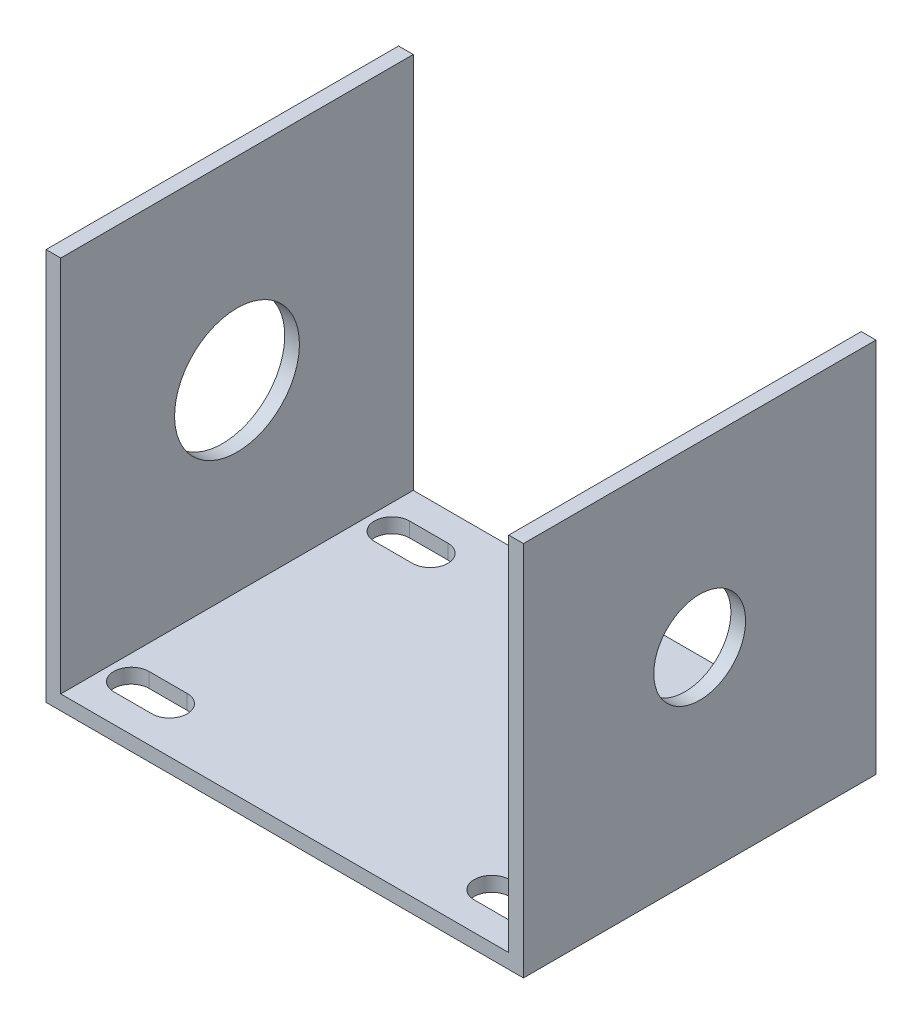
ISO-10303-21;
HEADER;
FILE_DESCRIPTION(('STEP AP214'),'2;1');
FILE_NAME('part.step','',(''),(''),'','','');
FILE_SCHEMA(('AUTOMOTIVE_DESIGN { 1 0 10303 214 1 1 1 1 }'));
ENDSEC;
DATA;
#1=APPLICATION_CONTEXT('core data for automotive mechanical design processes');
#2=APPLICATION_PROTOCOL_DEFINITION('international standard','automotive_design',2000,#1);
#3=PRODUCT_CONTEXT('',#1,'mechanical');
#4=PRODUCT('Part','Part','',(#3));
#5=PRODUCT_RELATED_PRODUCT_CATEGORY('part','',(#4));
#6=PRODUCT_DEFINITION_FORMATION('','',#4);
#7=PRODUCT_DEFINITION_CONTEXT('part definition',#1,'design');
#8=PRODUCT_DEFINITION('design','',#6,#7);
#9=PRODUCT_DEFINITION_SHAPE('','',#8);
#10=(LENGTH_UNIT() NAMED_UNIT(*) SI_UNIT(.MILLI.,.METRE.));
#11=(NAMED_UNIT(*) PLANE_ANGLE_UNIT() SI_UNIT($,.RADIAN.));
#12=(NAMED_UNIT(*) SI_UNIT($,.STERADIAN.) SOLID_ANGLE_UNIT());
#13=UNCERTAINTY_MEASURE_WITH_UNIT(LENGTH_MEASURE(1.E-05),#10,'distance_accuracy_value','');
#14=(GEOMETRIC_REPRESENTATION_CONTEXT(3) GLOBAL_UNCERTAINTY_ASSIGNED_CONTEXT((#13)) GLOBAL_UNIT_ASSIGNED_CONTEXT((#10,
#11,#12)) REPRESENTATION_CONTEXT('',''));
#15=CARTESIAN_POINT('',(0.,0.,0.));
#16=DIRECTION('',(0.,0.,1.));
#17=DIRECTION('',(1.,0.,0.));
#18=AXIS2_PLACEMENT_3D('',#15,#16,#17);
#19=CARTESIAN_POINT('',(0.,-0.5,12.));
#20=DIRECTION('',(0.,-1.,0.));
#21=DIRECTION('',(1.,0.,0.));
#22=AXIS2_PLACEMENT_3D('',#19,#20,#21);
#23=PLANE('',#22);
#24=CARTESIAN_POINT('',(10.97,-0.499999999999999,-8.87));
#25=DIRECTION('',(0.,-1.,0.));
#26=DIRECTION('',(1.,0.,0.));
#27=AXIS2_PLACEMENT_3D('',#24,#25,#26);
#28=CIRCLE('',#27,1.2);
#29=CARTESIAN_POINT('',(10.97,-0.499999999999999,-7.67000000000001));
#30=VERTEX_POINT('',#29);
#31=CARTESIAN_POINT('',(10.97,-0.499999999999999,-10.07));
#32=VERTEX_POINT('',#31);
#33=EDGE_CURVE('E114',#30,#32,#28,.T.);
#34=ORIENTED_EDGE('',*,*,#33,.F.);
#35=DIRECTION('',(-1.,0.,0.));
#36=VECTOR('',#35,1.);
#37=CARTESIAN_POINT('',(0.,-0.5,-7.67000000000002));
#38=LINE('',#37,#36);
#39=CARTESIAN_POINT('',(13.57,-0.499999999999998,-7.67));
#40=VERTEX_POINT('',#39);
#41=EDGE_CURVE('E323',#40,#30,#38,.T.);
#42=ORIENTED_EDGE('',*,*,#41,.F.);
#43=CARTESIAN_POINT('',(13.57,-0.499999999999998,-8.87));
#44=DIRECTION('',(0.,-1.,0.));
#45=DIRECTION('',(1.,0.,0.));
#46=AXIS2_PLACEMENT_3D('',#43,#44,#45);
#47=CIRCLE('',#46,1.2);
#48=CARTESIAN_POINT('',(13.57,-0.499999999999998,-10.07));
#49=VERTEX_POINT('',#48);
#50=EDGE_CURVE('E335',#49,#40,#47,.T.);
#51=ORIENTED_EDGE('',*,*,#50,.F.);
#52=DIRECTION('',(-1.,0.,0.));
#53=VECTOR('',#52,1.);
#54=CARTESIAN_POINT('',(0.,-0.5,-10.07));
#55=LINE('',#54,#53);
#56=EDGE_CURVE('E339',#49,#32,#55,.T.);
#57=ORIENTED_EDGE('',*,*,#56,.T.);
#58=EDGE_LOOP('',(#34,#42,#51,#57));
#59=FACE_BOUND('',#58,.T.);
#60=DIRECTION('',(1.,0.,0.));
#61=VECTOR('',#60,1.);
#62=CARTESIAN_POINT('',(0.,-0.5,-10.07));
#63=LINE('',#62,#61);
#64=CARTESIAN_POINT('',(-13.57,-0.500000000000002,-10.07));
#65=VERTEX_POINT('',#64);
#66=CARTESIAN_POINT('',(-10.97,-0.5,-10.07));
#67=VERTEX_POINT('',#66);
#68=EDGE_CURVE('E280',#65,#67,#63,.T.);
#69=ORIENTED_EDGE('',*,*,#68,.F.);
#70=CARTESIAN_POINT('',(-13.57,-0.500000000000002,-8.87));
#71=DIRECTION('',(0.,-1.,0.));
#72=DIRECTION('',(1.,0.,0.));
#73=AXIS2_PLACEMENT_3D('',#70,#71,#72);
#74=CIRCLE('',#73,1.2);
#75=CARTESIAN_POINT('',(-13.57,-0.500000000000002,-7.67));
#76=VERTEX_POINT('',#75);
#77=EDGE_CURVE('E263',#65,#76,#74,.F.);
#78=ORIENTED_EDGE('',*,*,#77,.T.);
#79=DIRECTION('',(1.,0.,0.));
#80=VECTOR('',#79,1.);
#81=CARTESIAN_POINT('',(0.,-0.5,-7.67000000000002));
#82=LINE('',#81,#80);
#83=CARTESIAN_POINT('',(-10.97,-0.500000000000001,-7.67000000000001));
#84=VERTEX_POINT('',#83);
#85=EDGE_CURVE('E274',#76,#84,#82,.T.);
#86=ORIENTED_EDGE('',*,*,#85,.T.);
#87=CARTESIAN_POINT('',(-10.97,-0.500000000000001,-8.87));
#88=DIRECTION('',(0.,1.,0.));
#89=DIRECTION('',(-1.,0.,0.));
#90=AXIS2_PLACEMENT_3D('',#87,#88,#89);
#91=CIRCLE('',#90,1.2);
#92=EDGE_CURVE('E285',#84,#67,#91,.T.);
#93=ORIENTED_EDGE('',*,*,#92,.T.);
#94=EDGE_LOOP('',(#69,#78,#86,#93));
#95=FACE_BOUND('',#94,.T.);
#96=DIRECTION('',(-1.,0.,0.));
#97=VECTOR('',#96,1.);
#98=CARTESIAN_POINT('',(0.,-0.5,10.07));
#99=LINE('',#98,#97);
#100=CARTESIAN_POINT('',(13.57,-0.499999999999998,10.07));
#101=VERTEX_POINT('',#100);
#102=CARTESIAN_POINT('',(10.97,-0.5,10.07));
#103=VERTEX_POINT('',#102);
#104=EDGE_CURVE('E356',#101,#103,#99,.T.);
#105=ORIENTED_EDGE('',*,*,#104,.F.);
#106=CARTESIAN_POINT('',(13.57,-0.499999999999998,8.87));
#107=DIRECTION('',(0.,-1.,0.));
#108=DIRECTION('',(1.,0.,0.));
#109=AXIS2_PLACEMENT_3D('',#106,#107,#108);
#110=CIRCLE('',#109,1.2);
#111=CARTESIAN_POINT('',(13.57,-0.499999999999998,7.67));
#112=VERTEX_POINT('',#111);
#113=EDGE_CURVE('E352',#101,#112,#110,.F.);
#114=ORIENTED_EDGE('',*,*,#113,.T.);
#115=DIRECTION('',(-1.,0.,0.));
#116=VECTOR('',#115,1.);
#117=CARTESIAN_POINT('',(0.,-0.5,7.67000000000002));
#118=LINE('',#117,#116);
#119=CARTESIAN_POINT('',(10.97,-0.499999999999999,7.67000000000001));
#120=VERTEX_POINT('',#119);
#121=EDGE_CURVE('E348',#112,#120,#118,.T.);
#122=ORIENTED_EDGE('',*,*,#121,.T.);
#123=CARTESIAN_POINT('',(10.97,-0.499999999999999,8.87));
#124=DIRECTION('',(0.,-1.,0.));
#125=DIRECTION('',(1.,0.,0.));
#126=AXIS2_PLACEMENT_3D('',#123,#124,#125);
#127=CIRCLE('',#126,1.2);
#128=EDGE_CURVE('E319',#120,#103,#127,.F.);
#129=ORIENTED_EDGE('',*,*,#128,.T.);
#130=EDGE_LOOP('',(#105,#114,#122,#129));
#131=FACE_BOUND('',#130,.T.);
#132=DIRECTION('',(-1.,0.,0.));
#133=VECTOR('',#132,1.);
#134=CARTESIAN_POINT('',(0.,-0.5,-12.));
#135=LINE('',#134,#133);
#136=CARTESIAN_POINT('',(16.25,-0.499999999999998,-12.));
#137=VERTEX_POINT('',#136);
#138=CARTESIAN_POINT('',(-16.25,-0.500000000000002,-12.));
#139=VERTEX_POINT('',#138);
#140=EDGE_CURVE('E419',#137,#139,#135,.T.);
#141=ORIENTED_EDGE('',*,*,#140,.F.);
#142=DIRECTION('',(0.,0.,-1.));
#143=VECTOR('',#142,1.);
#144=CARTESIAN_POINT('',(16.25,-0.499999999999998,12.));
#145=LINE('',#144,#143);
#146=CARTESIAN_POINT('',(16.25,-0.499999999999998,12.));
#147=VERTEX_POINT('',#146);
#148=EDGE_CURVE('E463',#147,#137,#145,.T.);
#149=ORIENTED_EDGE('',*,*,#148,.F.);
#150=DIRECTION('',(-1.,0.,0.));
#151=VECTOR('',#150,1.);
#152=CARTESIAN_POINT('',(0.,-0.5,12.));
#153=LINE('',#152,#151);
#154=CARTESIAN_POINT('',(-16.25,-0.500000000000002,12.));
#155=VERTEX_POINT('',#154);
#156=EDGE_CURVE('E390',#147,#155,#153,.T.);
#157=ORIENTED_EDGE('',*,*,#156,.T.);
#158=DIRECTION('',(0.,0.,-1.));
#159=VECTOR('',#158,1.);
#160=CARTESIAN_POINT('',(-16.25,-0.500000000000002,12.));
#161=LINE('',#160,#159);
#162=EDGE_CURVE('E466',#155,#139,#161,.T.);
#163=ORIENTED_EDGE('',*,*,#162,.T.);
#164=EDGE_LOOP('',(#141,#149,#157,#163));
#165=FACE_BOUND('',#164,.T.);
#166=CARTESIAN_POINT('',(-13.57,-0.500000000000002,8.87));
#167=DIRECTION('',(0.,-1.,0.));
#168=DIRECTION('',(1.,0.,0.));
#169=AXIS2_PLACEMENT_3D('',#166,#167,#168);
#170=CIRCLE('',#169,1.2);
#171=CARTESIAN_POINT('',(-13.57,-0.500000000000002,10.07));
#172=VERTEX_POINT('',#171);
#173=CARTESIAN_POINT('',(-13.57,-0.500000000000002,7.67));
#174=VERTEX_POINT('',#173);
#175=EDGE_CURVE('E106',#172,#174,#170,.T.);
#176=ORIENTED_EDGE('',*,*,#175,.F.);
#177=DIRECTION('',(1.,0.,0.));
#178=VECTOR('',#177,1.);
#179=CARTESIAN_POINT('',(0.,-0.5,10.07));
#180=LINE('',#179,#178);
#181=CARTESIAN_POINT('',(-10.97,-0.500000000000001,10.07));
#182=VERTEX_POINT('',#181);
#183=EDGE_CURVE('E296',#172,#182,#180,.T.);
#184=ORIENTED_EDGE('',*,*,#183,.T.);
#185=CARTESIAN_POINT('',(-10.97,-0.500000000000001,8.87));
#186=DIRECTION('',(0.,-1.,0.));
#187=DIRECTION('',(1.,0.,0.));
#188=AXIS2_PLACEMENT_3D('',#185,#186,#187);
#189=CIRCLE('',#188,1.2);
#190=CARTESIAN_POINT('',(-10.97,-0.500000000000001,7.67000000000001));
#191=VERTEX_POINT('',#190);
#192=EDGE_CURVE('E309',#191,#182,#189,.T.);
#193=ORIENTED_EDGE('',*,*,#192,.F.);
#194=DIRECTION('',(1.,0.,0.));
#195=VECTOR('',#194,1.);
#196=CARTESIAN_POINT('',(0.,-0.5,7.67000000000002));
#197=LINE('',#196,#195);
#198=EDGE_CURVE('E313',#174,#191,#197,.T.);
#199=ORIENTED_EDGE('',*,*,#198,.F.);
#200=EDGE_LOOP('',(#176,#184,#193,#199));
#201=FACE_BOUND('',#200,.T.);
#202=ADVANCED_FACE('F90',(#59,#95,#131,#165,#201),#23,.T.);
#203=CARTESIAN_POINT('',(0.,0.5,12.));
#204=DIRECTION('',(0.,-1.,0.));
#205=DIRECTION('',(1.,0.,0.));
#206=AXIS2_PLACEMENT_3D('',#203,#204,#205);
#207=PLANE('',#206);
#208=CARTESIAN_POINT('',(-13.57,0.5,-8.87));
#209=DIRECTION('',(0.,-1.,0.));
#210=DIRECTION('',(1.,0.,0.));
#211=AXIS2_PLACEMENT_3D('',#208,#209,#210);
#212=CIRCLE('',#211,1.2);
#213=CARTESIAN_POINT('',(-13.57,0.499999999999997,-10.07));
#214=VERTEX_POINT('',#213);
#215=CARTESIAN_POINT('',(-13.57,0.499999999999997,-7.67));
#216=VERTEX_POINT('',#215);
#217=EDGE_CURVE('E266',#214,#216,#212,.F.);
#218=ORIENTED_EDGE('',*,*,#217,.F.);
#219=DIRECTION('',(1.,0.,0.));
#220=VECTOR('',#219,1.);
#221=CARTESIAN_POINT('',(0.,0.5,-10.07));
#222=LINE('',#221,#220);
#223=CARTESIAN_POINT('',(-10.97,0.5,-10.07));
#224=VERTEX_POINT('',#223);
#225=EDGE_CURVE('E489',#214,#224,#222,.T.);
#226=ORIENTED_EDGE('',*,*,#225,.T.);
#227=CARTESIAN_POINT('',(-10.97,0.5,-8.87));
#228=DIRECTION('',(0.,-1.,0.));
#229=DIRECTION('',(1.,0.,0.));
#230=AXIS2_PLACEMENT_3D('',#227,#228,#229);
#231=CIRCLE('',#230,1.2);
#232=CARTESIAN_POINT('',(-10.97,0.5,-7.67));
#233=VERTEX_POINT('',#232);
#234=EDGE_CURVE('E486',#233,#224,#231,.F.);
#235=ORIENTED_EDGE('',*,*,#234,.F.);
#236=DIRECTION('',(1.,0.,0.));
#237=VECTOR('',#236,1.);
#238=CARTESIAN_POINT('',(0.,0.5,-7.67000000000002));
#239=LINE('',#238,#237);
#240=EDGE_CURVE('E493',#216,#233,#239,.T.);
#241=ORIENTED_EDGE('',*,*,#240,.F.);
#242=EDGE_LOOP('',(#218,#226,#235,#241));
#243=FACE_BOUND('',#242,.T.);
#244=CARTESIAN_POINT('',(13.57,0.5,8.87));
#245=DIRECTION('',(0.,-1.,0.));
#246=DIRECTION('',(1.,0.,0.));
#247=AXIS2_PLACEMENT_3D('',#244,#245,#246);
#248=CIRCLE('',#247,1.2);
#249=CARTESIAN_POINT('',(13.57,0.5,10.07));
#250=VERTEX_POINT('',#249);
#251=CARTESIAN_POINT('',(13.57,0.5,7.67));
#252=VERTEX_POINT('',#251);
#253=EDGE_CURVE('E483',#250,#252,#248,.F.);
#254=ORIENTED_EDGE('',*,*,#253,.F.);
#255=DIRECTION('',(-1.,0.,0.));
#256=VECTOR('',#255,1.);
#257=CARTESIAN_POINT('',(0.,0.5,10.07));
#258=LINE('',#257,#256);
#259=CARTESIAN_POINT('',(10.97,0.5,10.07));
#260=VERTEX_POINT('',#259);
#261=EDGE_CURVE('E479',#250,#260,#258,.T.);
#262=ORIENTED_EDGE('',*,*,#261,.T.);
#263=CARTESIAN_POINT('',(10.97,0.5,8.87));
#264=DIRECTION('',(0.,-1.,0.));
#265=DIRECTION('',(1.,0.,0.));
#266=AXIS2_PLACEMENT_3D('',#263,#264,#265);
#267=CIRCLE('',#266,1.2);
#268=CARTESIAN_POINT('',(10.97,0.5,7.67));
#269=VERTEX_POINT('',#268);
#270=EDGE_CURVE('E469',#269,#260,#267,.F.);
#271=ORIENTED_EDGE('',*,*,#270,.F.);
#272=DIRECTION('',(-1.,0.,0.));
#273=VECTOR('',#272,1.);
#274=CARTESIAN_POINT('',(0.,0.5,7.67000000000002));
#275=LINE('',#274,#273);
#276=EDGE_CURVE('E475',#252,#269,#275,.T.);
#277=ORIENTED_EDGE('',*,*,#276,.F.);
#278=EDGE_LOOP('',(#254,#262,#271,#277));
#279=FACE_BOUND('',#278,.T.);
#280=DIRECTION('',(-1.,0.,0.));
#281=VECTOR('',#280,1.);
#282=CARTESIAN_POINT('',(0.,0.5,-12.));
#283=LINE('',#282,#281);
#284=CARTESIAN_POINT('',(15.25,0.500000000000002,-12.));
#285=VERTEX_POINT('',#284);
#286=CARTESIAN_POINT('',(-15.25,0.499999999999998,-12.));
#287=VERTEX_POINT('',#286);
#288=EDGE_CURVE('E434',#285,#287,#283,.T.);
#289=ORIENTED_EDGE('',*,*,#288,.T.);
#290=DIRECTION('',(0.,0.,-1.));
#291=VECTOR('',#290,1.);
#292=CARTESIAN_POINT('',(-15.25,0.499999999999998,12.));
#293=LINE('',#292,#291);
#294=CARTESIAN_POINT('',(-15.25,0.499999999999998,12.));
#295=VERTEX_POINT('',#294);
#296=EDGE_CURVE('E449',#295,#287,#293,.T.);
#297=ORIENTED_EDGE('',*,*,#296,.F.);
#298=DIRECTION('',(-1.,0.,0.));
#299=VECTOR('',#298,1.);
#300=CARTESIAN_POINT('',(0.,0.5,12.));
#301=LINE('',#300,#299);
#302=CARTESIAN_POINT('',(15.25,0.500000000000002,12.));
#303=VERTEX_POINT('',#302);
#304=EDGE_CURVE('E405',#303,#295,#301,.T.);
#305=ORIENTED_EDGE('',*,*,#304,.F.);
#306=DIRECTION('',(0.,0.,-1.));
#307=VECTOR('',#306,1.);
#308=CARTESIAN_POINT('',(15.25,0.500000000000002,12.));
#309=LINE('',#308,#307);
#310=EDGE_CURVE('E453',#303,#285,#309,.T.);
#311=ORIENTED_EDGE('',*,*,#310,.T.);
#312=EDGE_LOOP('',(#289,#297,#305,#311));
#313=FACE_BOUND('',#312,.T.);
#314=DIRECTION('',(-1.,0.,0.));
#315=VECTOR('',#314,1.);
#316=CARTESIAN_POINT('',(0.,0.5,-7.67000000000002));
#317=LINE('',#316,#315);
#318=CARTESIAN_POINT('',(13.57,0.5,-7.67));
#319=VERTEX_POINT('',#318);
#320=CARTESIAN_POINT('',(10.97,0.5,-7.67000000000001));
#321=VERTEX_POINT('',#320);
#322=EDGE_CURVE('E505',#319,#321,#317,.T.);
#323=ORIENTED_EDGE('',*,*,#322,.T.);
#324=CARTESIAN_POINT('',(10.97,0.5,-8.87));
#325=DIRECTION('',(0.,-1.,0.));
#326=DIRECTION('',(1.,0.,0.));
#327=AXIS2_PLACEMENT_3D('',#324,#325,#326);
#328=CIRCLE('',#327,1.2);
#329=CARTESIAN_POINT('',(10.97,0.5,-10.07));
#330=VERTEX_POINT('',#329);
#331=EDGE_CURVE('E509',#321,#330,#328,.T.);
#332=ORIENTED_EDGE('',*,*,#331,.T.);
#333=DIRECTION('',(-1.,0.,0.));
#334=VECTOR('',#333,1.);
#335=CARTESIAN_POINT('',(0.,0.5,-10.07));
#336=LINE('',#335,#334);
#337=CARTESIAN_POINT('',(13.57,0.500000000000002,-10.07));
#338=VERTEX_POINT('',#337);
#339=EDGE_CURVE('E498',#338,#330,#336,.T.);
#340=ORIENTED_EDGE('',*,*,#339,.F.);
#341=CARTESIAN_POINT('',(13.57,0.5,-8.87));
#342=DIRECTION('',(0.,-1.,0.));
#343=DIRECTION('',(1.,0.,0.));
#344=AXIS2_PLACEMENT_3D('',#341,#342,#343);
#345=CIRCLE('',#344,1.2);
#346=EDGE_CURVE('E501',#338,#319,#345,.T.);
#347=ORIENTED_EDGE('',*,*,#346,.T.);
#348=EDGE_LOOP('',(#323,#332,#340,#347));
#349=FACE_BOUND('',#348,.T.);
#350=DIRECTION('',(1.,0.,0.));
#351=VECTOR('',#350,1.);
#352=CARTESIAN_POINT('',(0.,0.5,10.07));
#353=LINE('',#352,#351);
#354=CARTESIAN_POINT('',(-13.57,0.499999999999997,10.07));
#355=VERTEX_POINT('',#354);
#356=CARTESIAN_POINT('',(-10.97,0.5,10.07));
#357=VERTEX_POINT('',#356);
#358=EDGE_CURVE('E99',#355,#357,#353,.T.);
#359=ORIENTED_EDGE('',*,*,#358,.F.);
#360=CARTESIAN_POINT('',(-13.57,0.5,8.87));
#361=DIRECTION('',(0.,-1.,0.));
#362=DIRECTION('',(1.,0.,0.));
#363=AXIS2_PLACEMENT_3D('',#360,#361,#362);
#364=CIRCLE('',#363,1.2);
#365=CARTESIAN_POINT('',(-13.57,0.499999999999997,7.67));
#366=VERTEX_POINT('',#365);
#367=EDGE_CURVE('E12',#355,#366,#364,.T.);
#368=ORIENTED_EDGE('',*,*,#367,.T.);
#369=DIRECTION('',(1.,0.,0.));
#370=VECTOR('',#369,1.);
#371=CARTESIAN_POINT('',(0.,0.5,7.67000000000002));
#372=LINE('',#371,#370);
#373=CARTESIAN_POINT('',(-10.97,0.499999999999999,7.67000000000001));
#374=VERTEX_POINT('',#373);
#375=EDGE_CURVE('E513',#366,#374,#372,.T.);
#376=ORIENTED_EDGE('',*,*,#375,.T.);
#377=CARTESIAN_POINT('',(-10.97,0.5,8.87));
#378=DIRECTION('',(0.,-1.,0.));
#379=DIRECTION('',(1.,0.,0.));
#380=AXIS2_PLACEMENT_3D('',#377,#378,#379);
#381=CIRCLE('',#380,1.2);
#382=EDGE_CURVE('E517',#374,#357,#381,.T.);
#383=ORIENTED_EDGE('',*,*,#382,.T.);
#384=EDGE_LOOP('',(#359,#368,#376,#383));
#385=FACE_BOUND('',#384,.T.);
#386=ADVANCED_FACE('F532',(#243,#279,#313,#349,#385),#207,.F.);
#387=CARTESIAN_POINT('',(-16.25,0.,12.));
#388=DIRECTION('',(-1.,0.,0.));
#389=DIRECTION('',(0.,-1.,0.));
#390=AXIS2_PLACEMENT_3D('',#387,#388,#389);
#391=PLANE('',#390);
#392=CARTESIAN_POINT('',(-16.25,13.,0.));
#393=DIRECTION('',(-1.,0.,0.));
#394=DIRECTION('',(0.,-1.,0.));
#395=AXIS2_PLACEMENT_3D('',#392,#393,#394);
#396=CIRCLE('',#395,4.25);
#397=CARTESIAN_POINT('',(-16.25,17.25,0.));
#398=VERTEX_POINT('',#397);
#399=EDGE_CURVE('E373',#398,#398,#396,.F.);
#400=ORIENTED_EDGE('',*,*,#399,.T.);
#401=EDGE_LOOP('',(#400));
#402=FACE_BOUND('',#401,.T.);
#403=DIRECTION('',(0.,1.,0.));
#404=VECTOR('',#403,1.);
#405=CARTESIAN_POINT('',(-16.25,0.,-12.));
#406=LINE('',#405,#404);
#407=CARTESIAN_POINT('',(-16.25,26.2,-12.));
#408=VERTEX_POINT('',#407);
#409=EDGE_CURVE('E385',#139,#408,#406,.T.);
#410=ORIENTED_EDGE('',*,*,#409,.F.);
#411=ORIENTED_EDGE('',*,*,#162,.F.);
#412=DIRECTION('',(0.,1.,0.));
#413=VECTOR('',#412,1.);
#414=CARTESIAN_POINT('',(-16.25,0.,12.));
#415=LINE('',#414,#413);
#416=CARTESIAN_POINT('',(-16.25,26.2,12.));
#417=VERTEX_POINT('',#416);
#418=EDGE_CURVE('E386',#155,#417,#415,.T.);
#419=ORIENTED_EDGE('',*,*,#418,.T.);
#420=DIRECTION('',(0.,0.,-1.));
#421=VECTOR('',#420,1.);
#422=CARTESIAN_POINT('',(-16.25,26.2,12.));
#423=LINE('',#422,#421);
#424=EDGE_CURVE('E415',#417,#408,#423,.T.);
#425=ORIENTED_EDGE('',*,*,#424,.T.);
#426=EDGE_LOOP('',(#410,#411,#419,#425));
#427=FACE_BOUND('',#426,.T.);
#428=ADVANCED_FACE('F92',(#402,#427),#391,.T.);
#429=CARTESIAN_POINT('',(16.25,0.,12.));
#430=DIRECTION('',(-1.,0.,0.));
#431=DIRECTION('',(0.,0.,1.));
#432=AXIS2_PLACEMENT_3D('',#429,#430,#431);
#433=PLANE('',#432);
#434=CARTESIAN_POINT('',(16.25,13.,0.));
#435=DIRECTION('',(-1.,0.,0.));
#436=DIRECTION('',(0.,0.,1.));
#437=AXIS2_PLACEMENT_3D('',#434,#435,#436);
#438=CIRCLE('',#437,3.125);
#439=CARTESIAN_POINT('',(16.25,13.,3.125));
#440=VERTEX_POINT('',#439);
#441=EDGE_CURVE('E381',#440,#440,#438,.T.);
#442=ORIENTED_EDGE('',*,*,#441,.T.);
#443=EDGE_LOOP('',(#442));
#444=FACE_BOUND('',#443,.T.);
#445=DIRECTION('',(0.,1.,0.));
#446=VECTOR('',#445,1.);
#447=CARTESIAN_POINT('',(16.25,0.,-12.));
#448=LINE('',#447,#446);
#449=CARTESIAN_POINT('',(16.25,25.1137931034483,-12.));
#450=VERTEX_POINT('',#449);
#451=EDGE_CURVE('E423',#137,#450,#448,.T.);
#452=ORIENTED_EDGE('',*,*,#451,.T.);
#453=DIRECTION('',(0.,0.,-1.));
#454=VECTOR('',#453,1.);
#455=CARTESIAN_POINT('',(16.25,25.1137931034483,12.));
#456=LINE('',#455,#454);
#457=CARTESIAN_POINT('',(16.25,25.1137931034483,12.));
#458=VERTEX_POINT('',#457);
#459=EDGE_CURVE('E459',#458,#450,#456,.T.);
#460=ORIENTED_EDGE('',*,*,#459,.F.);
#461=DIRECTION('',(0.,1.,0.));
#462=VECTOR('',#461,1.);
#463=CARTESIAN_POINT('',(16.25,0.,12.));
#464=LINE('',#463,#462);
#465=EDGE_CURVE('E395',#147,#458,#464,.T.);
#466=ORIENTED_EDGE('',*,*,#465,.F.);
#467=ORIENTED_EDGE('',*,*,#148,.T.);
#468=EDGE_LOOP('',(#452,#460,#466,#467));
#469=FACE_BOUND('',#468,.T.);
#470=ADVANCED_FACE('F546',(#444,#469),#433,.F.);
#471=CARTESIAN_POINT('',(0.,25.1137931034482,12.));
#472=DIRECTION('',(0.,-1.,0.));
#473=DIRECTION('',(1.,0.,0.));
#474=AXIS2_PLACEMENT_3D('',#471,#472,#473);
#475=PLANE('',#474);
#476=DIRECTION('',(-1.,0.,0.));
#477=VECTOR('',#476,1.);
#478=CARTESIAN_POINT('',(0.,25.1137931034482,-12.));
#479=LINE('',#478,#477);
#480=CARTESIAN_POINT('',(15.25,25.1137931034483,-12.));
#481=VERTEX_POINT('',#480);
#482=EDGE_CURVE('E426',#450,#481,#479,.T.);
#483=ORIENTED_EDGE('',*,*,#482,.T.);
#484=DIRECTION('',(0.,0.,-1.));
#485=VECTOR('',#484,1.);
#486=CARTESIAN_POINT('',(15.25,25.1137931034483,12.));
#487=LINE('',#486,#485);
#488=CARTESIAN_POINT('',(15.25,25.1137931034483,12.));
#489=VERTEX_POINT('',#488);
#490=EDGE_CURVE('E456',#489,#481,#487,.T.);
#491=ORIENTED_EDGE('',*,*,#490,.F.);
#492=DIRECTION('',(-1.,0.,0.));
#493=VECTOR('',#492,1.);
#494=CARTESIAN_POINT('',(0.,25.1137931034482,12.));
#495=LINE('',#494,#493);
#496=EDGE_CURVE('E398',#458,#489,#495,.T.);
#497=ORIENTED_EDGE('',*,*,#496,.F.);
#498=ORIENTED_EDGE('',*,*,#459,.T.);
#499=EDGE_LOOP('',(#483,#491,#497,#498));
#500=FACE_BOUND('',#499,.T.);
#501=ADVANCED_FACE('F549',(#500),#475,.F.);
#502=CARTESIAN_POINT('',(15.25,0.,12.));
#503=DIRECTION('',(-1.,0.,0.));
#504=DIRECTION('',(0.,-1.,0.));
#505=AXIS2_PLACEMENT_3D('',#502,#503,#504);
#506=PLANE('',#505);
#507=CARTESIAN_POINT('',(15.25,13.,0.));
#508=DIRECTION('',(-1.,0.,0.));
#509=DIRECTION('',(0.,-1.,0.));
#510=AXIS2_PLACEMENT_3D('',#507,#508,#509);
#511=CIRCLE('',#510,3.125);
#512=CARTESIAN_POINT('',(15.25,9.875,0.));
#513=VERTEX_POINT('',#512);
#514=EDGE_CURVE('E377',#513,#513,#511,.T.);
#515=ORIENTED_EDGE('',*,*,#514,.F.);
#516=EDGE_LOOP('',(#515));
#517=FACE_BOUND('',#516,.T.);
#518=DIRECTION('',(0.,1.,0.));
#519=VECTOR('',#518,1.);
#520=CARTESIAN_POINT('',(15.25,0.,-12.));
#521=LINE('',#520,#519);
#522=EDGE_CURVE('E430',#285,#481,#521,.T.);
#523=ORIENTED_EDGE('',*,*,#522,.F.);
#524=ORIENTED_EDGE('',*,*,#310,.F.);
#525=DIRECTION('',(0.,1.,0.));
#526=VECTOR('',#525,1.);
#527=CARTESIAN_POINT('',(15.25,0.,12.));
#528=LINE('',#527,#526);
#529=EDGE_CURVE('E401',#303,#489,#528,.T.);
#530=ORIENTED_EDGE('',*,*,#529,.T.);
#531=ORIENTED_EDGE('',*,*,#490,.T.);
#532=EDGE_LOOP('',(#523,#524,#530,#531));
#533=FACE_BOUND('',#532,.T.);
#534=ADVANCED_FACE('F553',(#517,#533),#506,.T.);
#535=CARTESIAN_POINT('',(-15.25,0.,12.));
#536=DIRECTION('',(-1.,0.,0.));
#537=DIRECTION('',(0.,-1.,0.));
#538=AXIS2_PLACEMENT_3D('',#535,#536,#537);
#539=PLANE('',#538);
#540=CARTESIAN_POINT('',(-15.25,13.,0.));
#541=DIRECTION('',(-1.,0.,0.));
#542=DIRECTION('',(0.,-1.,0.));
#543=AXIS2_PLACEMENT_3D('',#540,#541,#542);
#544=CIRCLE('',#543,4.25);
#545=CARTESIAN_POINT('',(-15.25,17.25,0.));
#546=VERTEX_POINT('',#545);
#547=EDGE_CURVE('E364',#546,#546,#544,.F.);
#548=ORIENTED_EDGE('',*,*,#547,.F.);
#549=EDGE_LOOP('',(#548));
#550=FACE_BOUND('',#549,.T.);
#551=DIRECTION('',(0.,1.,0.));
#552=VECTOR('',#551,1.);
#553=CARTESIAN_POINT('',(-15.25,0.,-12.));
#554=LINE('',#553,#552);
#555=CARTESIAN_POINT('',(-15.25,26.2,-12.));
#556=VERTEX_POINT('',#555);
#557=EDGE_CURVE('E437',#287,#556,#554,.T.);
#558=ORIENTED_EDGE('',*,*,#557,.T.);
#559=DIRECTION('',(0.,0.,-1.));
#560=VECTOR('',#559,1.);
#561=CARTESIAN_POINT('',(-15.25,26.2,12.));
#562=LINE('',#561,#560);
#563=CARTESIAN_POINT('',(-15.25,26.2,12.));
#564=VERTEX_POINT('',#563);
#565=EDGE_CURVE('E446',#564,#556,#562,.T.);
#566=ORIENTED_EDGE('',*,*,#565,.F.);
#567=DIRECTION('',(0.,1.,0.));
#568=VECTOR('',#567,1.);
#569=CARTESIAN_POINT('',(-15.25,0.,12.));
#570=LINE('',#569,#568);
#571=EDGE_CURVE('E408',#295,#564,#570,.T.);
#572=ORIENTED_EDGE('',*,*,#571,.F.);
#573=ORIENTED_EDGE('',*,*,#296,.T.);
#574=EDGE_LOOP('',(#558,#566,#572,#573));
#575=FACE_BOUND('',#574,.T.);
#576=ADVANCED_FACE('F555',(#550,#575),#539,.F.);
#577=CARTESIAN_POINT('',(0.,26.2000000000001,12.));
#578=DIRECTION('',(0.,1.,0.));
#579=DIRECTION('',(-1.,0.,0.));
#580=AXIS2_PLACEMENT_3D('',#577,#578,#579);
#581=PLANE('',#580);
#582=DIRECTION('',(1.,0.,0.));
#583=VECTOR('',#582,1.);
#584=CARTESIAN_POINT('',(0.,26.2000000000001,-12.));
#585=LINE('',#584,#583);
#586=EDGE_CURVE('E391',#408,#556,#585,.T.);
#587=ORIENTED_EDGE('',*,*,#586,.F.);
#588=ORIENTED_EDGE('',*,*,#424,.F.);
#589=DIRECTION('',(1.,0.,0.));
#590=VECTOR('',#589,1.);
#591=CARTESIAN_POINT('',(0.,26.2000000000001,12.));
#592=LINE('',#591,#590);
#593=EDGE_CURVE('E411',#417,#564,#592,.T.);
#594=ORIENTED_EDGE('',*,*,#593,.T.);
#595=ORIENTED_EDGE('',*,*,#565,.T.);
#596=EDGE_LOOP('',(#587,#588,#594,#595));
#597=FACE_BOUND('',#596,.T.);
#598=ADVANCED_FACE('F560',(#597),#581,.T.);
#599=CARTESIAN_POINT('',(0.,0.,12.));
#600=DIRECTION('',(0.,0.,1.));
#601=DIRECTION('',(1.,0.,0.));
#602=AXIS2_PLACEMENT_3D('',#599,#600,#601);
#603=PLANE('',#602);
#604=ORIENTED_EDGE('',*,*,#418,.F.);
#605=ORIENTED_EDGE('',*,*,#156,.F.);
#606=ORIENTED_EDGE('',*,*,#465,.T.);
#607=ORIENTED_EDGE('',*,*,#496,.T.);
#608=ORIENTED_EDGE('',*,*,#529,.F.);
#609=ORIENTED_EDGE('',*,*,#304,.T.);
#610=ORIENTED_EDGE('',*,*,#571,.T.);
#611=ORIENTED_EDGE('',*,*,#593,.F.);
#612=EDGE_LOOP('',(#604,#605,#606,#607,#608,#609,#610,#611));
#613=FACE_BOUND('',#612,.T.);
#614=ADVANCED_FACE('F564',(#613),#603,.T.);
#615=CARTESIAN_POINT('',(0.,0.,-12.));
#616=DIRECTION('',(0.,0.,1.));
#617=DIRECTION('',(1.,0.,0.));
#618=AXIS2_PLACEMENT_3D('',#615,#616,#617);
#619=PLANE('',#618);
#620=ORIENTED_EDGE('',*,*,#409,.T.);
#621=ORIENTED_EDGE('',*,*,#586,.T.);
#622=ORIENTED_EDGE('',*,*,#557,.F.);
#623=ORIENTED_EDGE('',*,*,#288,.F.);
#624=ORIENTED_EDGE('',*,*,#522,.T.);
#625=ORIENTED_EDGE('',*,*,#482,.F.);
#626=ORIENTED_EDGE('',*,*,#451,.F.);
#627=ORIENTED_EDGE('',*,*,#140,.T.);
#628=EDGE_LOOP('',(#620,#621,#622,#623,#624,#625,#626,#627));
#629=FACE_BOUND('',#628,.T.);
#630=ADVANCED_FACE('F566',(#629),#619,.F.);
#631=CARTESIAN_POINT('',(-16.25,13.,0.));
#632=DIRECTION('',(1.,0.,0.));
#633=DIRECTION('',(0.,0.,-1.));
#634=AXIS2_PLACEMENT_3D('',#631,#632,#633);
#635=CYLINDRICAL_SURFACE('',#634,3.125);
#636=ORIENTED_EDGE('',*,*,#514,.T.);
#637=EDGE_LOOP('',(#636));
#638=FACE_BOUND('',#637,.T.);
#639=ORIENTED_EDGE('',*,*,#441,.F.);
#640=EDGE_LOOP('',(#639));
#641=FACE_BOUND('',#640,.T.);
#642=ADVANCED_FACE('F569',(#638,#641),#635,.F.);
#643=CARTESIAN_POINT('',(-16.250012,13.,0.));
#644=DIRECTION('',(1.,0.,0.));
#645=DIRECTION('',(0.,1.,0.));
#646=AXIS2_PLACEMENT_3D('',#643,#644,#645);
#647=CYLINDRICAL_SURFACE('',#646,4.25);
#648=CARTESIAN_POINT('',(-16.25,17.25,0.));
#649=CARTESIAN_POINT('',(-16.2395833333333,17.25,0.));
#650=CARTESIAN_POINT('',(-16.2291666666667,17.25,0.));
#651=CARTESIAN_POINT('',(-16.2083333333333,17.25,0.));
#652=CARTESIAN_POINT('',(-16.1979166666667,17.25,0.));
#653=CARTESIAN_POINT('',(-16.1770833333333,17.25,0.));
#654=CARTESIAN_POINT('',(-16.1666666666667,17.25,0.));
#655=CARTESIAN_POINT('',(-16.1458333333333,17.25,0.));
#656=CARTESIAN_POINT('',(-16.1354166666667,17.25,0.));
#657=CARTESIAN_POINT('',(-16.1145833333333,17.25,0.));
#658=CARTESIAN_POINT('',(-16.1041666666667,17.25,0.));
#659=CARTESIAN_POINT('',(-16.0833333333333,17.25,0.));
#660=CARTESIAN_POINT('',(-16.0729166666667,17.25,0.));
#661=CARTESIAN_POINT('',(-16.0520833333333,17.25,0.));
#662=CARTESIAN_POINT('',(-16.0416666666667,17.25,0.));
#663=CARTESIAN_POINT('',(-16.0208333333333,17.25,0.));
#664=CARTESIAN_POINT('',(-16.0104166666667,17.25,0.));
#665=CARTESIAN_POINT('',(-15.9895833333333,17.25,0.));
#666=CARTESIAN_POINT('',(-15.9791666666667,17.25,0.));
#667=CARTESIAN_POINT('',(-15.9583333333333,17.25,0.));
#668=CARTESIAN_POINT('',(-15.9479166666667,17.25,0.));
#669=CARTESIAN_POINT('',(-15.9270833333333,17.25,0.));
#670=CARTESIAN_POINT('',(-15.9166666666667,17.25,0.));
#671=CARTESIAN_POINT('',(-15.8958333333333,17.25,0.));
#672=CARTESIAN_POINT('',(-15.8854166666667,17.25,0.));
#673=CARTESIAN_POINT('',(-15.8645833333333,17.25,0.));
#674=CARTESIAN_POINT('',(-15.8541666666667,17.25,0.));
#675=CARTESIAN_POINT('',(-15.8333333333333,17.25,0.));
#676=CARTESIAN_POINT('',(-15.8229166666667,17.25,0.));
#677=CARTESIAN_POINT('',(-15.8020833333333,17.25,0.));
#678=CARTESIAN_POINT('',(-15.7916666666667,17.25,0.));
#679=CARTESIAN_POINT('',(-15.7708333333333,17.25,0.));
#680=CARTESIAN_POINT('',(-15.7604166666667,17.25,0.));
#681=CARTESIAN_POINT('',(-15.7395833333333,17.25,0.));
#682=CARTESIAN_POINT('',(-15.7291666666667,17.25,0.));
#683=CARTESIAN_POINT('',(-15.7083333333333,17.25,0.));
#684=CARTESIAN_POINT('',(-15.6979166666667,17.25,0.));
#685=CARTESIAN_POINT('',(-15.6770833333333,17.25,0.));
#686=CARTESIAN_POINT('',(-15.6666666666667,17.25,0.));
#687=CARTESIAN_POINT('',(-15.6458333333333,17.25,0.));
#688=CARTESIAN_POINT('',(-15.6354166666667,17.25,0.));
#689=CARTESIAN_POINT('',(-15.6145833333333,17.25,0.));
#690=CARTESIAN_POINT('',(-15.6041666666667,17.25,0.));
#691=CARTESIAN_POINT('',(-15.5833333333333,17.25,0.));
#692=CARTESIAN_POINT('',(-15.5729166666667,17.25,0.));
#693=CARTESIAN_POINT('',(-15.5520833333333,17.25,0.));
#694=CARTESIAN_POINT('',(-15.5416666666667,17.25,0.));
#695=CARTESIAN_POINT('',(-15.5208333333333,17.25,0.));
#696=CARTESIAN_POINT('',(-15.5104166666667,17.25,0.));
#697=CARTESIAN_POINT('',(-15.4895833333333,17.25,0.));
#698=CARTESIAN_POINT('',(-15.4791666666667,17.25,0.));
#699=CARTESIAN_POINT('',(-15.4583333333333,17.25,0.));
#700=CARTESIAN_POINT('',(-15.4479166666667,17.25,0.));
#701=CARTESIAN_POINT('',(-15.4270833333333,17.25,0.));
#702=CARTESIAN_POINT('',(-15.4166666666667,17.25,0.));
#703=CARTESIAN_POINT('',(-15.3958333333333,17.25,0.));
#704=CARTESIAN_POINT('',(-15.3854166666667,17.25,0.));
#705=CARTESIAN_POINT('',(-15.3645833333333,17.25,0.));
#706=CARTESIAN_POINT('',(-15.3541666666667,17.25,0.));
#707=CARTESIAN_POINT('',(-15.3333333333333,17.25,0.));
#708=CARTESIAN_POINT('',(-15.3229166666667,17.25,0.));
#709=CARTESIAN_POINT('',(-15.3020833333333,17.25,0.));
#710=CARTESIAN_POINT('',(-15.2916666666667,17.25,0.));
#711=CARTESIAN_POINT('',(-15.2708333333333,17.25,0.));
#712=CARTESIAN_POINT('',(-15.2604166666667,17.25,0.));
#713=CARTESIAN_POINT('',(-15.25,17.25,0.));
#714=B_SPLINE_CURVE_WITH_KNOTS('',3,(#648,#649,#650,#651,#652,#653,#654,#655,#656,#657,#658,
#659,#660,#661,#662,#663,#664,#665,#666,#667,#668,#669,#670,#671,#672,#673,#674,#675,#676,#677,
#678,#679,#680,#681,#682,#683,#684,#685,#686,#687,#688,#689,#690,#691,#692,#693,#694,#695,#696,
#697,#698,#699,#700,#701,#702,#703,#704,#705,#706,#707,#708,#709,#710,#711,#712,#713),
.UNSPECIFIED.,.F.,.F.,(4,2,2,2,2,2,2,2,2,2,2,2,2,2,2,2,2,2,2,2,2,2,2,2,2,2,2,2,2,2,2,2,4),(0.,
0.03125,0.0625000000000001,0.0937500000000001,0.125,0.15625,0.1875,0.21875,0.25,0.28125,0.3125,
0.34375,0.375,0.40625,0.4375,0.46875,0.5,0.53125,0.5625,0.593750000000001,0.625000000000001,
0.656249999999999,0.687499999999999,0.718749999999999,0.749999999999999,0.781249999999999,
0.812499999999999,0.843749999999999,0.874999999999999,0.906249999999999,0.937499999999999,
0.968749999999999,0.999999999999999),.UNSPECIFIED.);
#715=EDGE_CURVE('BSEAM576',#398,#546,#714,.T.);
#716=ORIENTED_EDGE('',*,*,#399,.F.);
#717=ORIENTED_EDGE('',*,*,#547,.T.);
#718=ORIENTED_EDGE('',*,*,#715,.T.);
#719=ORIENTED_EDGE('',*,*,#715,.F.);
#720=EDGE_LOOP('',(#716,#718,#717,#719));
#721=FACE_BOUND('',#720,.T.);
#722=ADVANCED_FACE('F576',(#721),#647,.F.);
#723=CARTESIAN_POINT('',(0.,23.5,10.07));
#724=DIRECTION('',(0.,0.,1.));
#725=DIRECTION('',(1.,0.,0.));
#726=AXIS2_PLACEMENT_3D('',#723,#724,#725);
#727=PLANE('',#726);
#728=DIRECTION('',(0.,-1.,0.));
#729=VECTOR('',#728,1.);
#730=CARTESIAN_POINT('',(13.57,23.5,10.07));
#731=LINE('',#730,#729);
#732=EDGE_CURVE('E365',#250,#101,#731,.T.);
#733=ORIENTED_EDGE('',*,*,#732,.T.);
#734=ORIENTED_EDGE('',*,*,#104,.T.);
#735=DIRECTION('',(0.,-1.,0.));
#736=VECTOR('',#735,1.);
#737=CARTESIAN_POINT('',(10.97,23.5,10.07));
#738=LINE('',#737,#736);
#739=EDGE_CURVE('E360',#260,#103,#738,.T.);
#740=ORIENTED_EDGE('',*,*,#739,.F.);
#741=ORIENTED_EDGE('',*,*,#261,.F.);
#742=EDGE_LOOP('',(#733,#734,#740,#741));
#743=FACE_BOUND('',#742,.T.);
#744=ADVANCED_FACE('F580',(#743),#727,.F.);
#745=CARTESIAN_POINT('',(0.,23.5,7.67000000000002));
#746=DIRECTION('',(0.,0.,1.));
#747=DIRECTION('',(1.,0.,0.));
#748=AXIS2_PLACEMENT_3D('',#745,#746,#747);
#749=PLANE('',#748);
#750=ORIENTED_EDGE('',*,*,#276,.T.);
#751=DIRECTION('',(0.,-1.,0.));
#752=VECTOR('',#751,1.);
#753=CARTESIAN_POINT('',(10.97,23.5,7.67000000000001));
#754=LINE('',#753,#752);
#755=EDGE_CURVE('E359',#269,#120,#754,.T.);
#756=ORIENTED_EDGE('',*,*,#755,.T.);
#757=ORIENTED_EDGE('',*,*,#121,.F.);
#758=DIRECTION('',(0.,-1.,0.));
#759=VECTOR('',#758,1.);
#760=CARTESIAN_POINT('',(13.57,23.5,7.67));
#761=LINE('',#760,#759);
#762=EDGE_CURVE('E368',#252,#112,#761,.T.);
#763=ORIENTED_EDGE('',*,*,#762,.F.);
#764=EDGE_LOOP('',(#750,#756,#757,#763));
#765=FACE_BOUND('',#764,.T.);
#766=ADVANCED_FACE('F587',(#765),#749,.T.);
#767=CARTESIAN_POINT('',(13.57,23.5,8.87));
#768=DIRECTION('',(0.,-1.,0.));
#769=DIRECTION('',(1.,0.,0.));
#770=AXIS2_PLACEMENT_3D('',#767,#768,#769);
#771=CYLINDRICAL_SURFACE('',#770,1.2);
#772=ORIENTED_EDGE('',*,*,#253,.T.);
#773=ORIENTED_EDGE('',*,*,#762,.T.);
#774=ORIENTED_EDGE('',*,*,#113,.F.);
#775=ORIENTED_EDGE('',*,*,#732,.F.);
#776=EDGE_LOOP('',(#772,#773,#774,#775));
#777=FACE_BOUND('',#776,.T.);
#778=ADVANCED_FACE('F585',(#777),#771,.F.);
#779=CARTESIAN_POINT('',(10.97,23.5,8.87));
#780=DIRECTION('',(0.,-1.,0.));
#781=DIRECTION('',(1.,0.,0.));
#782=AXIS2_PLACEMENT_3D('',#779,#780,#781);
#783=CYLINDRICAL_SURFACE('',#782,1.2);
#784=ORIENTED_EDGE('',*,*,#270,.T.);
#785=ORIENTED_EDGE('',*,*,#739,.T.);
#786=ORIENTED_EDGE('',*,*,#128,.F.);
#787=ORIENTED_EDGE('',*,*,#755,.F.);
#788=EDGE_LOOP('',(#784,#785,#786,#787));
#789=FACE_BOUND('',#788,.T.);
#790=ADVANCED_FACE('F582',(#789),#783,.F.);
#791=CARTESIAN_POINT('',(-13.57,23.5,-8.87));
#792=DIRECTION('',(0.,-1.,0.));
#793=DIRECTION('',(1.,0.,0.));
#794=AXIS2_PLACEMENT_3D('',#791,#792,#793);
#795=CYLINDRICAL_SURFACE('',#794,1.2);
#796=ORIENTED_EDGE('',*,*,#217,.T.);
#797=DIRECTION('',(0.,-1.,0.));
#798=VECTOR('',#797,1.);
#799=CARTESIAN_POINT('',(-13.57,23.5,-7.67));
#800=LINE('',#799,#798);
#801=EDGE_CURVE('E258',#216,#76,#800,.T.);
#802=ORIENTED_EDGE('',*,*,#801,.T.);
#803=ORIENTED_EDGE('',*,*,#77,.F.);
#804=DIRECTION('',(0.,-1.,0.));
#805=VECTOR('',#804,1.);
#806=CARTESIAN_POINT('',(-13.57,23.5,-10.07));
#807=LINE('',#806,#805);
#808=EDGE_CURVE('E281',#214,#65,#807,.T.);
#809=ORIENTED_EDGE('',*,*,#808,.F.);
#810=EDGE_LOOP('',(#796,#802,#803,#809));
#811=FACE_BOUND('',#810,.T.);
#812=ADVANCED_FACE('F260',(#811),#795,.F.);
#813=CARTESIAN_POINT('',(0.,23.5,-7.67000000000002));
#814=DIRECTION('',(0.,0.,-1.));
#815=DIRECTION('',(-1.,0.,0.));
#816=AXIS2_PLACEMENT_3D('',#813,#814,#815);
#817=PLANE('',#816);
#818=ORIENTED_EDGE('',*,*,#240,.T.);
#819=DIRECTION('',(0.,-1.,0.));
#820=VECTOR('',#819,1.);
#821=CARTESIAN_POINT('',(-10.97,23.5,-7.67000000000001));
#822=LINE('',#821,#820);
#823=EDGE_CURVE('E271',#233,#84,#822,.T.);
#824=ORIENTED_EDGE('',*,*,#823,.T.);
#825=ORIENTED_EDGE('',*,*,#85,.F.);
#826=ORIENTED_EDGE('',*,*,#801,.F.);
#827=EDGE_LOOP('',(#818,#824,#825,#826));
#828=FACE_BOUND('',#827,.T.);
#829=ADVANCED_FACE('F275',(#828),#817,.T.);
#830=CARTESIAN_POINT('',(0.,23.5,-10.07));
#831=DIRECTION('',(0.,0.,-1.));
#832=DIRECTION('',(-1.,0.,0.));
#833=AXIS2_PLACEMENT_3D('',#830,#831,#832);
#834=PLANE('',#833);
#835=ORIENTED_EDGE('',*,*,#808,.T.);
#836=ORIENTED_EDGE('',*,*,#68,.T.);
#837=DIRECTION('',(0.,-1.,0.));
#838=VECTOR('',#837,1.);
#839=CARTESIAN_POINT('',(-10.97,23.5,-10.07));
#840=LINE('',#839,#838);
#841=EDGE_CURVE('E636',#224,#67,#840,.T.);
#842=ORIENTED_EDGE('',*,*,#841,.F.);
#843=ORIENTED_EDGE('',*,*,#225,.F.);
#844=EDGE_LOOP('',(#835,#836,#842,#843));
#845=FACE_BOUND('',#844,.T.);
#846=ADVANCED_FACE('F623',(#845),#834,.F.);
#847=CARTESIAN_POINT('',(-10.97,23.5,-8.87));
#848=DIRECTION('',(0.,-1.,0.));
#849=DIRECTION('',(1.,0.,0.));
#850=AXIS2_PLACEMENT_3D('',#847,#848,#849);
#851=CYLINDRICAL_SURFACE('',#850,1.2);
#852=ORIENTED_EDGE('',*,*,#234,.T.);
#853=ORIENTED_EDGE('',*,*,#841,.T.);
#854=ORIENTED_EDGE('',*,*,#92,.F.);
#855=ORIENTED_EDGE('',*,*,#823,.F.);
#856=EDGE_LOOP('',(#852,#853,#854,#855));
#857=FACE_BOUND('',#856,.T.);
#858=ADVANCED_FACE('F612',(#857),#851,.F.);
#859=CARTESIAN_POINT('',(10.97,23.5,-8.87));
#860=DIRECTION('',(0.,-1.,0.));
#861=DIRECTION('',(1.,0.,0.));
#862=AXIS2_PLACEMENT_3D('',#859,#860,#861);
#863=CYLINDRICAL_SURFACE('',#862,1.2);
#864=DIRECTION('',(0.,-1.,0.));
#865=VECTOR('',#864,1.);
#866=CARTESIAN_POINT('',(10.97,23.5,-7.67000000000001));
#867=LINE('',#866,#865);
#868=EDGE_CURVE('E289',#321,#30,#867,.T.);
#869=ORIENTED_EDGE('',*,*,#868,.T.);
#870=ORIENTED_EDGE('',*,*,#33,.T.);
#871=DIRECTION('',(0.,-1.,0.));
#872=VECTOR('',#871,1.);
#873=CARTESIAN_POINT('',(10.97,23.5,-10.07));
#874=LINE('',#873,#872);
#875=EDGE_CURVE('E320',#330,#32,#874,.T.);
#876=ORIENTED_EDGE('',*,*,#875,.F.);
#877=ORIENTED_EDGE('',*,*,#331,.F.);
#878=EDGE_LOOP('',(#869,#870,#876,#877));
#879=FACE_BOUND('',#878,.T.);
#880=ADVANCED_FACE('F601',(#879),#863,.F.);
#881=CARTESIAN_POINT('',(0.,23.5,-7.67000000000002));
#882=DIRECTION('',(0.,0.,1.));
#883=DIRECTION('',(1.,0.,0.));
#884=AXIS2_PLACEMENT_3D('',#881,#882,#883);
#885=PLANE('',#884);
#886=DIRECTION('',(0.,-1.,0.));
#887=VECTOR('',#886,1.);
#888=CARTESIAN_POINT('',(13.57,23.5,-7.67));
#889=LINE('',#888,#887);
#890=EDGE_CURVE('E327',#319,#40,#889,.T.);
#891=ORIENTED_EDGE('',*,*,#890,.T.);
#892=ORIENTED_EDGE('',*,*,#41,.T.);
#893=ORIENTED_EDGE('',*,*,#868,.F.);
#894=ORIENTED_EDGE('',*,*,#322,.F.);
#895=EDGE_LOOP('',(#891,#892,#893,#894));
#896=FACE_BOUND('',#895,.T.);
#897=ADVANCED_FACE('F597',(#896),#885,.F.);
#898=CARTESIAN_POINT('',(13.57,23.5,-8.87));
#899=DIRECTION('',(0.,-1.,0.));
#900=DIRECTION('',(1.,0.,0.));
#901=AXIS2_PLACEMENT_3D('',#898,#899,#900);
#902=CYLINDRICAL_SURFACE('',#901,1.2);
#903=DIRECTION('',(0.,-1.,0.));
#904=VECTOR('',#903,1.);
#905=CARTESIAN_POINT('',(13.57,23.5,-10.07));
#906=LINE('',#905,#904);
#907=EDGE_CURVE('E324',#338,#49,#906,.T.);
#908=ORIENTED_EDGE('',*,*,#907,.T.);
#909=ORIENTED_EDGE('',*,*,#50,.T.);
#910=ORIENTED_EDGE('',*,*,#890,.F.);
#911=ORIENTED_EDGE('',*,*,#346,.F.);
#912=EDGE_LOOP('',(#908,#909,#910,#911));
#913=FACE_BOUND('',#912,.T.);
#914=ADVANCED_FACE('F600',(#913),#902,.F.);
#915=CARTESIAN_POINT('',(0.,23.5,-10.07));
#916=DIRECTION('',(0.,0.,1.));
#917=DIRECTION('',(1.,0.,0.));
#918=AXIS2_PLACEMENT_3D('',#915,#916,#917);
#919=PLANE('',#918);
#920=ORIENTED_EDGE('',*,*,#339,.T.);
#921=ORIENTED_EDGE('',*,*,#875,.T.);
#922=ORIENTED_EDGE('',*,*,#56,.F.);
#923=ORIENTED_EDGE('',*,*,#907,.F.);
#924=EDGE_LOOP('',(#920,#921,#922,#923));
#925=FACE_BOUND('',#924,.T.);
#926=ADVANCED_FACE('F605',(#925),#919,.T.);
#927=CARTESIAN_POINT('',(-13.57,23.5,8.87));
#928=DIRECTION('',(0.,-1.,0.));
#929=DIRECTION('',(1.,0.,0.));
#930=AXIS2_PLACEMENT_3D('',#927,#928,#929);
#931=CYLINDRICAL_SURFACE('',#930,1.2);
#932=DIRECTION('',(0.,-1.,0.));
#933=VECTOR('',#932,1.);
#934=CARTESIAN_POINT('',(-13.57,23.5,10.07));
#935=LINE('',#934,#933);
#936=EDGE_CURVE('E303',#355,#172,#935,.T.);
#937=ORIENTED_EDGE('',*,*,#936,.T.);
#938=ORIENTED_EDGE('',*,*,#175,.T.);
#939=DIRECTION('',(0.,-1.,0.));
#940=VECTOR('',#939,1.);
#941=CARTESIAN_POINT('',(-13.57,23.5,7.67));
#942=LINE('',#941,#940);
#943=EDGE_CURVE('E293',#366,#174,#942,.T.);
#944=ORIENTED_EDGE('',*,*,#943,.F.);
#945=ORIENTED_EDGE('',*,*,#367,.F.);
#946=EDGE_LOOP('',(#937,#938,#944,#945));
#947=FACE_BOUND('',#946,.T.);
#948=ADVANCED_FACE('F536',(#947),#931,.F.);
#949=CARTESIAN_POINT('',(0.,23.5,10.07));
#950=DIRECTION('',(0.,0.,-1.));
#951=DIRECTION('',(-1.,0.,0.));
#952=AXIS2_PLACEMENT_3D('',#949,#950,#951);
#953=PLANE('',#952);
#954=ORIENTED_EDGE('',*,*,#358,.T.);
#955=DIRECTION('',(0.,-1.,0.));
#956=VECTOR('',#955,1.);
#957=CARTESIAN_POINT('',(-10.97,23.5,10.07));
#958=LINE('',#957,#956);
#959=EDGE_CURVE('E300',#357,#182,#958,.T.);
#960=ORIENTED_EDGE('',*,*,#959,.T.);
#961=ORIENTED_EDGE('',*,*,#183,.F.);
#962=ORIENTED_EDGE('',*,*,#936,.F.);
#963=EDGE_LOOP('',(#954,#960,#961,#962));
#964=FACE_BOUND('',#963,.T.);
#965=ADVANCED_FACE('F525',(#964),#953,.T.);
#966=CARTESIAN_POINT('',(-10.97,23.5,8.87));
#967=DIRECTION('',(0.,-1.,0.));
#968=DIRECTION('',(1.,0.,0.));
#969=AXIS2_PLACEMENT_3D('',#966,#967,#968);
#970=CYLINDRICAL_SURFACE('',#969,1.2);
#971=DIRECTION('',(0.,-1.,0.));
#972=VECTOR('',#971,1.);
#973=CARTESIAN_POINT('',(-10.97,23.5,7.67000000000001));
#974=LINE('',#973,#972);
#975=EDGE_CURVE('E297',#374,#191,#974,.T.);
#976=ORIENTED_EDGE('',*,*,#975,.T.);
#977=ORIENTED_EDGE('',*,*,#192,.T.);
#978=ORIENTED_EDGE('',*,*,#959,.F.);
#979=ORIENTED_EDGE('',*,*,#382,.F.);
#980=EDGE_LOOP('',(#976,#977,#978,#979));
#981=FACE_BOUND('',#980,.T.);
#982=ADVANCED_FACE('F530',(#981),#970,.F.);
#983=CARTESIAN_POINT('',(0.,23.5,7.67000000000002));
#984=DIRECTION('',(0.,0.,-1.));
#985=DIRECTION('',(-1.,0.,0.));
#986=AXIS2_PLACEMENT_3D('',#983,#984,#985);
#987=PLANE('',#986);
#988=ORIENTED_EDGE('',*,*,#943,.T.);
#989=ORIENTED_EDGE('',*,*,#198,.T.);
#990=ORIENTED_EDGE('',*,*,#975,.F.);
#991=ORIENTED_EDGE('',*,*,#375,.F.);
#992=EDGE_LOOP('',(#988,#989,#990,#991));
#993=FACE_BOUND('',#992,.T.);
#994=ADVANCED_FACE('F534',(#993),#987,.F.);
#995=CLOSED_SHELL('',(#202,#386,#428,#470,#501,#534,#576,#598,#614,#630,#642,#722,#744,#766,
#778,#790,#812,#829,#846,#858,#880,#897,#914,#926,#948,#965,#982,#994));
#996=MANIFOLD_SOLID_BREP('B2',#995);
#997=ADVANCED_BREP_SHAPE_REPRESENTATION('',(#18,#996),#14);
#998=SHAPE_DEFINITION_REPRESENTATION(#9,#997);
ENDSEC;
END-ISO-10303-21;
